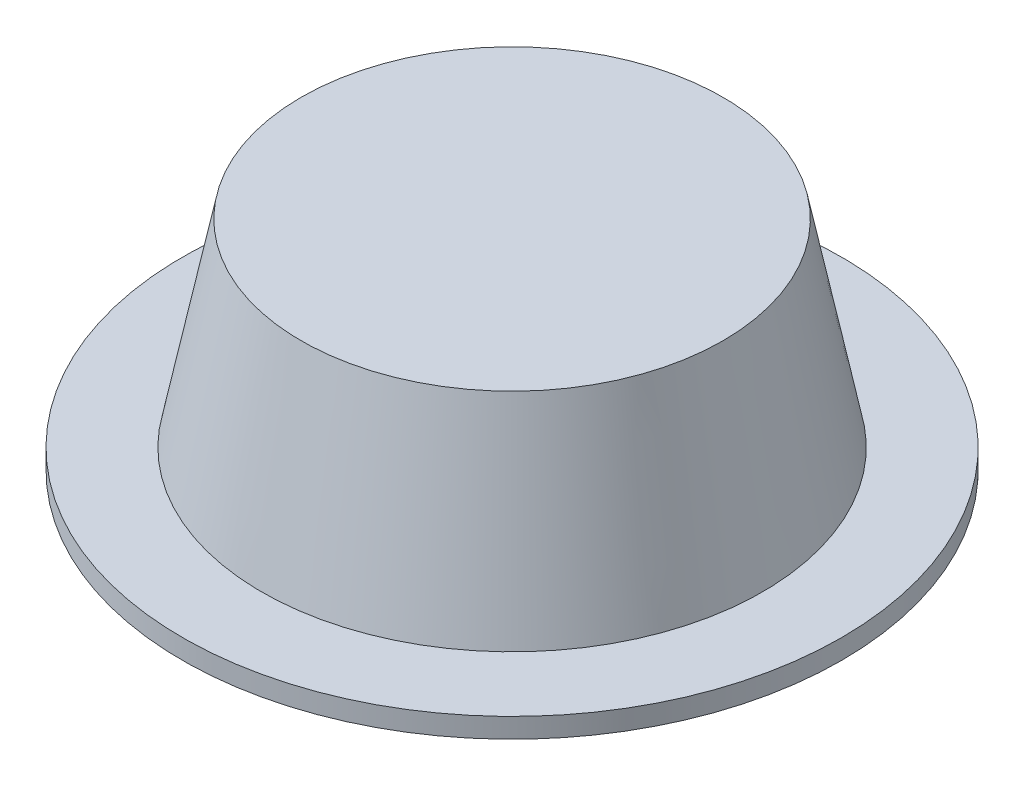
ISO-10303-21;
HEADER;
FILE_DESCRIPTION(('STEP AP214'),'2;1');
FILE_NAME('part.step','',(''),(''),'','','');
FILE_SCHEMA(('AUTOMOTIVE_DESIGN { 1 0 10303 214 1 1 1 1 }'));
ENDSEC;
DATA;
#1=APPLICATION_CONTEXT('core data for automotive mechanical design processes');
#2=APPLICATION_PROTOCOL_DEFINITION('international standard','automotive_design',2000,#1);
#3=PRODUCT_CONTEXT('',#1,'mechanical');
#4=PRODUCT('Part','Part','',(#3));
#5=PRODUCT_RELATED_PRODUCT_CATEGORY('part','',(#4));
#6=PRODUCT_DEFINITION_FORMATION('','',#4);
#7=PRODUCT_DEFINITION_CONTEXT('part definition',#1,'design');
#8=PRODUCT_DEFINITION('design','',#6,#7);
#9=PRODUCT_DEFINITION_SHAPE('','',#8);
#10=(LENGTH_UNIT() NAMED_UNIT(*) SI_UNIT(.MILLI.,.METRE.));
#11=(NAMED_UNIT(*) PLANE_ANGLE_UNIT() SI_UNIT($,.RADIAN.));
#12=(NAMED_UNIT(*) SI_UNIT($,.STERADIAN.) SOLID_ANGLE_UNIT());
#13=UNCERTAINTY_MEASURE_WITH_UNIT(LENGTH_MEASURE(1.E-05),#10,'distance_accuracy_value','');
#14=(GEOMETRIC_REPRESENTATION_CONTEXT(3) GLOBAL_UNCERTAINTY_ASSIGNED_CONTEXT((#13)) GLOBAL_UNIT_ASSIGNED_CONTEXT((#10,
#11,#12)) REPRESENTATION_CONTEXT('',''));
#15=CARTESIAN_POINT('',(0.,0.,0.));
#16=DIRECTION('',(0.,0.,1.));
#17=DIRECTION('',(1.,0.,0.));
#18=AXIS2_PLACEMENT_3D('',#15,#16,#17);
#19=CARTESIAN_POINT('',(0.,-1.5,0.));
#20=DIRECTION('',(0.,-1.,0.));
#21=DIRECTION('',(1.,0.,0.));
#22=AXIS2_PLACEMENT_3D('',#19,#20,#21);
#23=PLANE('',#22);
#24=CARTESIAN_POINT('',(0.,-1.5,0.));
#25=DIRECTION('',(0.,-1.,0.));
#26=DIRECTION('',(1.,0.,0.));
#27=AXIS2_PLACEMENT_3D('',#24,#25,#26);
#28=CIRCLE('',#27,25.);
#29=CARTESIAN_POINT('',(25.,-1.5,0.));
#30=VERTEX_POINT('',#29);
#31=EDGE_CURVE('E11',#30,#30,#28,.T.);
#32=ORIENTED_EDGE('',*,*,#31,.T.);
#33=EDGE_LOOP('',(#32));
#34=FACE_BOUND('',#33,.T.);
#35=CARTESIAN_POINT('',(0.,-1.5,0.));
#36=DIRECTION('',(0.,-1.,0.));
#37=DIRECTION('',(1.,0.,0.));
#38=AXIS2_PLACEMENT_3D('',#35,#36,#37);
#39=CIRCLE('',#38,15.9405882918443);
#40=CARTESIAN_POINT('',(15.9405882918443,-1.5,0.));
#41=VERTEX_POINT('',#40);
#42=EDGE_CURVE('E54',#41,#41,#39,.T.);
#43=ORIENTED_EDGE('',*,*,#42,.F.);
#44=EDGE_LOOP('',(#43));
#45=FACE_BOUND('',#44,.T.);
#46=ADVANCED_FACE('F43',(#34,#45),#23,.T.);
#47=CARTESIAN_POINT('',(0.,0.,0.));
#48=DIRECTION('',(0.,-1.,0.));
#49=DIRECTION('',(1.,0.,0.));
#50=AXIS2_PLACEMENT_3D('',#47,#48,#49);
#51=PLANE('',#50);
#52=CARTESIAN_POINT('',(0.,0.,0.));
#53=DIRECTION('',(0.,-1.,0.));
#54=DIRECTION('',(1.,0.,0.));
#55=AXIS2_PLACEMENT_3D('',#52,#53,#54);
#56=CIRCLE('',#55,25.);
#57=CARTESIAN_POINT('',(25.,0.,0.));
#58=VERTEX_POINT('',#57);
#59=EDGE_CURVE('E47',#58,#58,#56,.T.);
#60=ORIENTED_EDGE('',*,*,#59,.F.);
#61=EDGE_LOOP('',(#60));
#62=FACE_BOUND('',#61,.T.);
#63=CARTESIAN_POINT('',(0.,0.,0.));
#64=DIRECTION('',(0.,-1.,0.));
#65=DIRECTION('',(1.,0.,0.));
#66=AXIS2_PLACEMENT_3D('',#63,#64,#65);
#67=CIRCLE('',#66,15.9405882918443);
#68=CARTESIAN_POINT('',(15.9405882918443,0.,0.));
#69=VERTEX_POINT('',#68);
#70=EDGE_CURVE('E56',#69,#69,#67,.T.);
#71=ORIENTED_EDGE('',*,*,#70,.T.);
#72=EDGE_LOOP('',(#71));
#73=FACE_BOUND('',#72,.T.);
#74=ADVANCED_FACE('F66',(#62,#73),#51,.F.);
#75=CARTESIAN_POINT('',(0.,-1.5,0.));
#76=DIRECTION('',(0.,1.,0.));
#77=DIRECTION('',(-1.,0.,0.));
#78=AXIS2_PLACEMENT_3D('',#75,#76,#77);
#79=CYLINDRICAL_SURFACE('',#78,25.);
#80=ORIENTED_EDGE('',*,*,#31,.F.);
#81=EDGE_LOOP('',(#80));
#82=FACE_BOUND('',#81,.T.);
#83=ORIENTED_EDGE('',*,*,#59,.T.);
#84=EDGE_LOOP('',(#83));
#85=FACE_BOUND('',#84,.T.);
#86=ADVANCED_FACE('F45',(#82,#85),#79,.T.);
#87=CARTESIAN_POINT('',(0.,-1.5,0.));
#88=DIRECTION('',(0.,1.,0.));
#89=DIRECTION('',(-1.,0.,0.));
#90=AXIS2_PLACEMENT_3D('',#87,#88,#89);
#91=CYLINDRICAL_SURFACE('',#90,15.9405882918443);
#92=ORIENTED_EDGE('',*,*,#42,.T.);
#93=EDGE_LOOP('',(#92));
#94=FACE_BOUND('',#93,.T.);
#95=ORIENTED_EDGE('',*,*,#70,.F.);
#96=EDGE_LOOP('',(#95));
#97=FACE_BOUND('',#96,.T.);
#98=ADVANCED_FACE('F62',(#94,#97),#91,.F.);
#99=CLOSED_SHELL('',(#46,#74,#86,#98));
#100=MANIFOLD_SOLID_BREP('B2',#99);
#101=CARTESIAN_POINT('',(0.,12.,0.));
#102=DIRECTION('',(0.,-1.,0.));
#103=DIRECTION('',(1.,0.,0.));
#104=AXIS2_PLACEMENT_3D('',#101,#102,#103);
#105=PLANE('',#104);
#106=CARTESIAN_POINT('',(0.,12.,0.));
#107=DIRECTION('',(0.,-1.,0.));
#108=DIRECTION('',(1.,0.,0.));
#109=AXIS2_PLACEMENT_3D('',#106,#107,#108);
#110=CIRCLE('',#109,13.5405882918443);
#111=CARTESIAN_POINT('',(13.5405882918443,12.,0.));
#112=VERTEX_POINT('',#111);
#113=EDGE_CURVE('E183',#112,#112,#110,.F.);
#114=ORIENTED_EDGE('',*,*,#113,.F.);
#115=EDGE_LOOP('',(#114));
#116=FACE_BOUND('',#115,.T.);
#117=DIRECTION('',(1.,0.,0.));
#118=VECTOR('',#117,1.);
#119=CARTESIAN_POINT('',(-2.,12.,-6.));
#120=LINE('',#119,#118);
#121=CARTESIAN_POINT('',(-2.,12.,-6.));
#122=VERTEX_POINT('',#121);
#123=CARTESIAN_POINT('',(2.,12.,-6.));
#124=VERTEX_POINT('',#123);
#125=EDGE_CURVE('E161',#122,#124,#120,.T.);
#126=ORIENTED_EDGE('',*,*,#125,.F.);
#127=DIRECTION('',(0.,0.,-1.));
#128=VECTOR('',#127,1.);
#129=CARTESIAN_POINT('',(-2.,12.,6.));
#130=LINE('',#129,#128);
#131=CARTESIAN_POINT('',(-2.,12.,6.));
#132=VERTEX_POINT('',#131);
#133=EDGE_CURVE('E172',#132,#122,#130,.T.);
#134=ORIENTED_EDGE('',*,*,#133,.F.);
#135=DIRECTION('',(-1.,0.,0.));
#136=VECTOR('',#135,1.);
#137=CARTESIAN_POINT('',(-2.,12.,6.));
#138=LINE('',#137,#136);
#139=CARTESIAN_POINT('',(2.,12.,6.));
#140=VERTEX_POINT('',#139);
#141=EDGE_CURVE('E142',#140,#132,#138,.T.);
#142=ORIENTED_EDGE('',*,*,#141,.F.);
#143=DIRECTION('',(0.,0.,1.));
#144=VECTOR('',#143,1.);
#145=CARTESIAN_POINT('',(2.,12.,6.));
#146=LINE('',#145,#144);
#147=EDGE_CURVE('E176',#124,#140,#146,.T.);
#148=ORIENTED_EDGE('',*,*,#147,.F.);
#149=EDGE_LOOP('',(#126,#134,#142,#148));
#150=FACE_BOUND('',#149,.T.);
#151=ADVANCED_FACE('F105',(#116,#150),#105,.T.);
#152=CARTESIAN_POINT('',(0.,15.,0.));
#153=DIRECTION('',(0.,-1.,0.));
#154=DIRECTION('',(1.,0.,0.));
#155=AXIS2_PLACEMENT_3D('',#152,#153,#154);
#156=PLANE('',#155);
#157=CARTESIAN_POINT('',(0.,15.,0.));
#158=DIRECTION('',(0.,1.,0.));
#159=DIRECTION('',(-1.,0.,0.));
#160=AXIS2_PLACEMENT_3D('',#157,#158,#159);
#161=CIRCLE('',#160,16.);
#162=CARTESIAN_POINT('',(-16.,15.,0.));
#163=VERTEX_POINT('',#162);
#164=EDGE_CURVE('E41',#163,#163,#161,.T.);
#165=ORIENTED_EDGE('',*,*,#164,.T.);
#166=EDGE_LOOP('',(#165));
#167=FACE_BOUND('',#166,.T.);
#168=ADVANCED_FACE('F107',(#167),#156,.F.);
#169=CARTESIAN_POINT('',(0.,0.,0.));
#170=DIRECTION('',(0.,-1.,0.));
#171=DIRECTION('',(1.,0.,0.));
#172=AXIS2_PLACEMENT_3D('',#169,#170,#171);
#173=CONICAL_SURFACE('',#172,19.,0.197395559849881);
#174=ORIENTED_EDGE('',*,*,#164,.F.);
#175=EDGE_LOOP('',(#174));
#176=FACE_BOUND('',#175,.T.);
#177=CARTESIAN_POINT('',(0.,0.,0.));
#178=DIRECTION('',(0.,1.,0.));
#179=DIRECTION('',(-1.,0.,0.));
#180=AXIS2_PLACEMENT_3D('',#177,#178,#179);
#181=CIRCLE('',#180,19.);
#182=CARTESIAN_POINT('',(-19.,0.,0.));
#183=VERTEX_POINT('',#182);
#184=EDGE_CURVE('E113',#183,#183,#181,.T.);
#185=ORIENTED_EDGE('',*,*,#184,.T.);
#186=EDGE_LOOP('',(#185));
#187=FACE_BOUND('',#186,.T.);
#188=ADVANCED_FACE('F190',(#176,#187),#173,.T.);
#189=CARTESIAN_POINT('',(0.,0.,0.));
#190=DIRECTION('',(0.,1.,0.));
#191=DIRECTION('',(-1.,0.,0.));
#192=AXIS2_PLACEMENT_3D('',#189,#190,#191);
#193=PLANE('',#192);
#194=CARTESIAN_POINT('',(0.,0.,0.));
#195=DIRECTION('',(0.,1.,0.));
#196=DIRECTION('',(-1.,0.,0.));
#197=AXIS2_PLACEMENT_3D('',#194,#195,#196);
#198=CIRCLE('',#197,15.9405882918443);
#199=CARTESIAN_POINT('',(-15.9405882918443,0.,0.));
#200=VERTEX_POINT('',#199);
#201=EDGE_CURVE('E182',#200,#200,#198,.T.);
#202=ORIENTED_EDGE('',*,*,#201,.T.);
#203=EDGE_LOOP('',(#202));
#204=FACE_BOUND('',#203,.T.);
#205=ORIENTED_EDGE('',*,*,#184,.F.);
#206=EDGE_LOOP('',(#205));
#207=FACE_BOUND('',#206,.T.);
#208=ADVANCED_FACE('F192',(#204,#207),#193,.F.);
#209=CARTESIAN_POINT('',(0.,-0.588348405414549,0.));
#210=DIRECTION('',(0.,-1.,0.));
#211=DIRECTION('',(1.,0.,0.));
#212=AXIS2_PLACEMENT_3D('',#209,#210,#211);
#213=CONICAL_SURFACE('',#212,16.0582579729272,0.197395559849881);
#214=ORIENTED_EDGE('',*,*,#113,.T.);
#215=EDGE_LOOP('',(#214));
#216=FACE_BOUND('',#215,.T.);
#217=ORIENTED_EDGE('',*,*,#201,.F.);
#218=EDGE_LOOP('',(#217));
#219=FACE_BOUND('',#218,.T.);
#220=ADVANCED_FACE('F194',(#216,#219),#213,.F.);
#221=CARTESIAN_POINT('',(-2.,1.,6.));
#222=DIRECTION('',(1.,0.,0.));
#223=DIRECTION('',(0.,1.,0.));
#224=AXIS2_PLACEMENT_3D('',#221,#222,#223);
#225=PLANE('',#224);
#226=ORIENTED_EDGE('',*,*,#133,.T.);
#227=DIRECTION('',(0.,1.,0.));
#228=VECTOR('',#227,1.);
#229=CARTESIAN_POINT('',(-2.,1.,-6.));
#230=LINE('',#229,#228);
#231=CARTESIAN_POINT('',(-2.,1.,-6.));
#232=VERTEX_POINT('',#231);
#233=EDGE_CURVE('E164',#232,#122,#230,.T.);
#234=ORIENTED_EDGE('',*,*,#233,.F.);
#235=DIRECTION('',(0.,0.,-1.));
#236=VECTOR('',#235,1.);
#237=CARTESIAN_POINT('',(-2.,1.,6.));
#238=LINE('',#237,#236);
#239=CARTESIAN_POINT('',(-2.,1.,6.));
#240=VERTEX_POINT('',#239);
#241=EDGE_CURVE('E154',#240,#232,#238,.T.);
#242=ORIENTED_EDGE('',*,*,#241,.F.);
#243=DIRECTION('',(0.,1.,0.));
#244=VECTOR('',#243,1.);
#245=CARTESIAN_POINT('',(-2.,1.,6.));
#246=LINE('',#245,#244);
#247=EDGE_CURVE('E168',#240,#132,#246,.T.);
#248=ORIENTED_EDGE('',*,*,#247,.T.);
#249=EDGE_LOOP('',(#226,#234,#242,#248));
#250=FACE_BOUND('',#249,.T.);
#251=ADVANCED_FACE('F201',(#250),#225,.F.);
#252=CARTESIAN_POINT('',(-2.,1.,-6.));
#253=DIRECTION('',(0.,0.,1.));
#254=DIRECTION('',(1.,0.,0.));
#255=AXIS2_PLACEMENT_3D('',#252,#253,#254);
#256=PLANE('',#255);
#257=ORIENTED_EDGE('',*,*,#125,.T.);
#258=DIRECTION('',(0.,1.,0.));
#259=VECTOR('',#258,1.);
#260=CARTESIAN_POINT('',(2.,1.,-6.));
#261=LINE('',#260,#259);
#262=CARTESIAN_POINT('',(2.,1.,-6.));
#263=VERTEX_POINT('',#262);
#264=EDGE_CURVE('E158',#263,#124,#261,.T.);
#265=ORIENTED_EDGE('',*,*,#264,.F.);
#266=DIRECTION('',(1.,0.,0.));
#267=VECTOR('',#266,1.);
#268=CARTESIAN_POINT('',(-2.,1.,-6.));
#269=LINE('',#268,#267);
#270=EDGE_CURVE('E149',#232,#263,#269,.T.);
#271=ORIENTED_EDGE('',*,*,#270,.F.);
#272=ORIENTED_EDGE('',*,*,#233,.T.);
#273=EDGE_LOOP('',(#257,#265,#271,#272));
#274=FACE_BOUND('',#273,.T.);
#275=ADVANCED_FACE('F159',(#274),#256,.F.);
#276=CARTESIAN_POINT('',(2.,1.,6.));
#277=DIRECTION('',(-1.,0.,0.));
#278=DIRECTION('',(0.,-1.,0.));
#279=AXIS2_PLACEMENT_3D('',#276,#277,#278);
#280=PLANE('',#279);
#281=ORIENTED_EDGE('',*,*,#147,.T.);
#282=DIRECTION('',(0.,1.,0.));
#283=VECTOR('',#282,1.);
#284=CARTESIAN_POINT('',(2.,1.,6.));
#285=LINE('',#284,#283);
#286=CARTESIAN_POINT('',(2.,1.,6.));
#287=VERTEX_POINT('',#286);
#288=EDGE_CURVE('E120',#287,#140,#285,.T.);
#289=ORIENTED_EDGE('',*,*,#288,.F.);
#290=DIRECTION('',(0.,0.,1.));
#291=VECTOR('',#290,1.);
#292=CARTESIAN_POINT('',(2.,1.,6.));
#293=LINE('',#292,#291);
#294=EDGE_CURVE('E152',#263,#287,#293,.T.);
#295=ORIENTED_EDGE('',*,*,#294,.F.);
#296=ORIENTED_EDGE('',*,*,#264,.T.);
#297=EDGE_LOOP('',(#281,#289,#295,#296));
#298=FACE_BOUND('',#297,.T.);
#299=ADVANCED_FACE('F166',(#298),#280,.F.);
#300=CARTESIAN_POINT('',(-2.,1.,6.));
#301=DIRECTION('',(0.,0.,-1.));
#302=DIRECTION('',(-1.,0.,0.));
#303=AXIS2_PLACEMENT_3D('',#300,#301,#302);
#304=PLANE('',#303);
#305=ORIENTED_EDGE('',*,*,#141,.T.);
#306=ORIENTED_EDGE('',*,*,#247,.F.);
#307=DIRECTION('',(-1.,0.,0.));
#308=VECTOR('',#307,1.);
#309=CARTESIAN_POINT('',(-2.,1.,6.));
#310=LINE('',#309,#308);
#311=EDGE_CURVE('E128',#287,#240,#310,.T.);
#312=ORIENTED_EDGE('',*,*,#311,.F.);
#313=ORIENTED_EDGE('',*,*,#288,.T.);
#314=EDGE_LOOP('',(#305,#306,#312,#313));
#315=FACE_BOUND('',#314,.T.);
#316=ADVANCED_FACE('F222',(#315),#304,.F.);
#317=CARTESIAN_POINT('',(0.,1.,0.));
#318=DIRECTION('',(0.,-1.,0.));
#319=DIRECTION('',(0.,0.,-1.));
#320=AXIS2_PLACEMENT_3D('',#317,#318,#319);
#321=PLANE('',#320);
#322=ORIENTED_EDGE('',*,*,#241,.T.);
#323=ORIENTED_EDGE('',*,*,#270,.T.);
#324=ORIENTED_EDGE('',*,*,#294,.T.);
#325=ORIENTED_EDGE('',*,*,#311,.T.);
#326=EDGE_LOOP('',(#322,#323,#324,#325));
#327=FACE_BOUND('',#326,.T.);
#328=ADVANCED_FACE('F150',(#327),#321,.T.);
#329=CLOSED_SHELL('',(#151,#168,#188,#208,#220,#251,#275,#299,#316,#328));
#330=MANIFOLD_SOLID_BREP('B6',#329);
#331=ADVANCED_BREP_SHAPE_REPRESENTATION('',(#18,#100,#330),#14);
#332=SHAPE_DEFINITION_REPRESENTATION(#9,#331);
ENDSEC;
END-ISO-10303-21;
